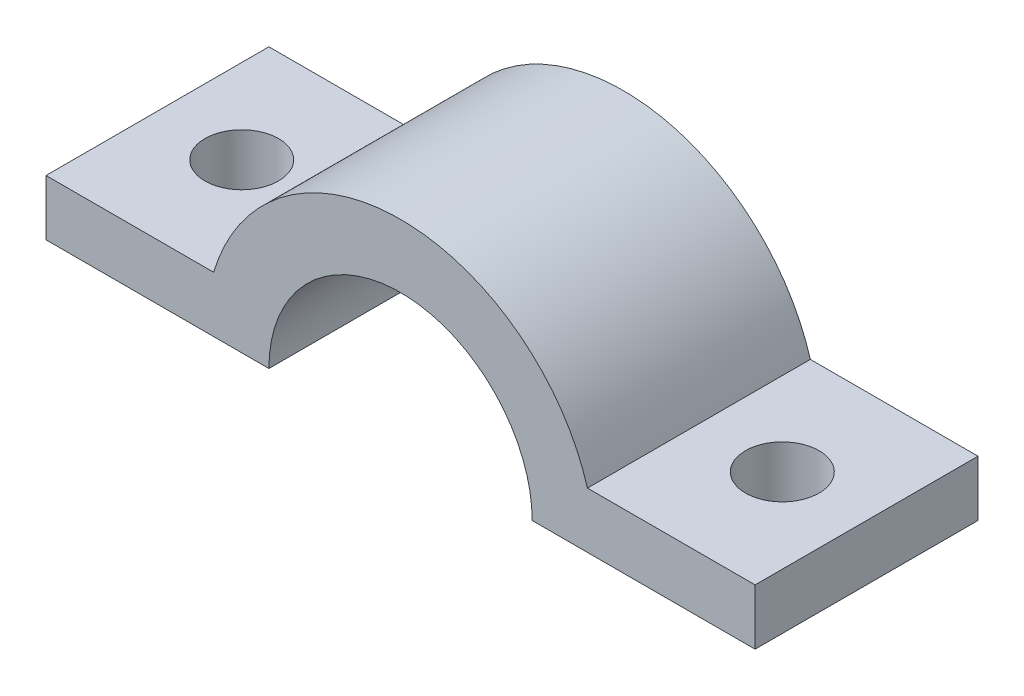
ISO-10303-21;
HEADER;
FILE_DESCRIPTION(('STEP AP214'),'2;1');
FILE_NAME('part.step','',(''),(''),'','','');
FILE_SCHEMA(('AUTOMOTIVE_DESIGN { 1 0 10303 214 1 1 1 1 }'));
ENDSEC;
DATA;
#1=APPLICATION_CONTEXT('core data for automotive mechanical design processes');
#2=APPLICATION_PROTOCOL_DEFINITION('international standard','automotive_design',2000,#1);
#3=PRODUCT_CONTEXT('',#1,'mechanical');
#4=PRODUCT('Part','Part','',(#3));
#5=PRODUCT_RELATED_PRODUCT_CATEGORY('part','',(#4));
#6=PRODUCT_DEFINITION_FORMATION('','',#4);
#7=PRODUCT_DEFINITION_CONTEXT('part definition',#1,'design');
#8=PRODUCT_DEFINITION('design','',#6,#7);
#9=PRODUCT_DEFINITION_SHAPE('','',#8);
#10=(LENGTH_UNIT() NAMED_UNIT(*) SI_UNIT(.MILLI.,.METRE.));
#11=(NAMED_UNIT(*) PLANE_ANGLE_UNIT() SI_UNIT($,.RADIAN.));
#12=(NAMED_UNIT(*) SI_UNIT($,.STERADIAN.) SOLID_ANGLE_UNIT());
#13=UNCERTAINTY_MEASURE_WITH_UNIT(LENGTH_MEASURE(1.E-05),#10,'distance_accuracy_value','');
#14=(GEOMETRIC_REPRESENTATION_CONTEXT(3) GLOBAL_UNCERTAINTY_ASSIGNED_CONTEXT((#13)) GLOBAL_UNIT_ASSIGNED_CONTEXT((#10,
#11,#12)) REPRESENTATION_CONTEXT('',''));
#15=CARTESIAN_POINT('',(0.,0.,0.));
#16=DIRECTION('',(0.,0.,1.));
#17=DIRECTION('',(1.,0.,0.));
#18=AXIS2_PLACEMENT_3D('',#15,#16,#17);
#19=CARTESIAN_POINT('',(-40.4,0.,25.4));
#20=DIRECTION('',(1.,0.,0.));
#21=DIRECTION('',(0.,0.,-1.));
#22=AXIS2_PLACEMENT_3D('',#19,#20,#21);
#23=PLANE('',#22);
#24=DIRECTION('',(0.,-1.,0.));
#25=VECTOR('',#24,1.);
#26=CARTESIAN_POINT('',(-40.4,0.,0.));
#27=LINE('',#26,#25);
#28=CARTESIAN_POINT('',(-40.4,6.35,0.));
#29=VERTEX_POINT('',#28);
#30=CARTESIAN_POINT('',(-40.4,0.,0.));
#31=VERTEX_POINT('',#30);
#32=EDGE_CURVE('E144',#29,#31,#27,.T.);
#33=ORIENTED_EDGE('',*,*,#32,.T.);
#34=DIRECTION('',(0.,0.,-1.));
#35=VECTOR('',#34,1.);
#36=CARTESIAN_POINT('',(-40.4,0.,25.4));
#37=LINE('',#36,#35);
#38=CARTESIAN_POINT('',(-40.4,0.,25.4));
#39=VERTEX_POINT('',#38);
#40=EDGE_CURVE('E11',#39,#31,#37,.T.);
#41=ORIENTED_EDGE('',*,*,#40,.F.);
#42=DIRECTION('',(0.,-1.,0.));
#43=VECTOR('',#42,1.);
#44=CARTESIAN_POINT('',(-40.4,0.,25.4));
#45=LINE('',#44,#43);
#46=CARTESIAN_POINT('',(-40.4,6.35,25.4));
#47=VERTEX_POINT('',#46);
#48=EDGE_CURVE('E167',#47,#39,#45,.T.);
#49=ORIENTED_EDGE('',*,*,#48,.F.);
#50=DIRECTION('',(0.,0.,-1.));
#51=VECTOR('',#50,1.);
#52=CARTESIAN_POINT('',(-40.4,6.35,25.4));
#53=LINE('',#52,#51);
#54=EDGE_CURVE('E140',#47,#29,#53,.T.);
#55=ORIENTED_EDGE('',*,*,#54,.T.);
#56=EDGE_LOOP('',(#33,#41,#49,#55));
#57=FACE_BOUND('',#56,.T.);
#58=ADVANCED_FACE('F43',(#57),#23,.F.);
#59=CARTESIAN_POINT('',(-40.4,0.,25.4));
#60=DIRECTION('',(0.,1.,0.));
#61=DIRECTION('',(0.,0.,1.));
#62=AXIS2_PLACEMENT_3D('',#59,#60,#61);
#63=PLANE('',#62);
#64=CARTESIAN_POINT('',(-30.7985474856855,0.,12.7));
#65=DIRECTION('',(0.,1.,0.));
#66=DIRECTION('',(0.,0.,1.));
#67=AXIS2_PLACEMENT_3D('',#64,#65,#66);
#68=CIRCLE('',#67,4.191);
#69=CARTESIAN_POINT('',(-30.7985474856855,0.,16.891));
#70=VERTEX_POINT('',#69);
#71=EDGE_CURVE('E149',#70,#70,#68,.F.);
#72=ORIENTED_EDGE('',*,*,#71,.F.);
#73=EDGE_LOOP('',(#72));
#74=FACE_BOUND('',#73,.T.);
#75=DIRECTION('',(1.,0.,0.));
#76=VECTOR('',#75,1.);
#77=CARTESIAN_POINT('',(-40.4,0.,0.));
#78=LINE('',#77,#76);
#79=CARTESIAN_POINT('',(-15.,0.,0.));
#80=VERTEX_POINT('',#79);
#81=EDGE_CURVE('E148',#31,#80,#78,.T.);
#82=ORIENTED_EDGE('',*,*,#81,.T.);
#83=DIRECTION('',(0.,0.,-1.));
#84=VECTOR('',#83,1.);
#85=CARTESIAN_POINT('',(-15.,0.,25.4));
#86=LINE('',#85,#84);
#87=CARTESIAN_POINT('',(-15.,0.,25.4));
#88=VERTEX_POINT('',#87);
#89=EDGE_CURVE('E52',#88,#80,#86,.T.);
#90=ORIENTED_EDGE('',*,*,#89,.F.);
#91=DIRECTION('',(1.,0.,0.));
#92=VECTOR('',#91,1.);
#93=CARTESIAN_POINT('',(-40.4,0.,25.4));
#94=LINE('',#93,#92);
#95=EDGE_CURVE('E103',#39,#88,#94,.T.);
#96=ORIENTED_EDGE('',*,*,#95,.F.);
#97=ORIENTED_EDGE('',*,*,#40,.T.);
#98=EDGE_LOOP('',(#82,#90,#96,#97));
#99=FACE_BOUND('',#98,.T.);
#100=ADVANCED_FACE('F242',(#74,#99),#63,.F.);
#101=CARTESIAN_POINT('',(0.,0.,25.4));
#102=DIRECTION('',(0.,0.,-1.));
#103=DIRECTION('',(-1.,0.,0.));
#104=AXIS2_PLACEMENT_3D('',#101,#102,#103);
#105=CYLINDRICAL_SURFACE('',#104,15.);
#106=CARTESIAN_POINT('',(0.,0.,0.));
#107=DIRECTION('',(0.,0.,-1.));
#108=DIRECTION('',(1.,0.,0.));
#109=AXIS2_PLACEMENT_3D('',#106,#107,#108);
#110=CIRCLE('',#109,15.);
#111=CARTESIAN_POINT('',(15.,0.,0.));
#112=VERTEX_POINT('',#111);
#113=EDGE_CURVE('E152',#80,#112,#110,.T.);
#114=ORIENTED_EDGE('',*,*,#113,.T.);
#115=DIRECTION('',(0.,0.,-1.));
#116=VECTOR('',#115,1.);
#117=CARTESIAN_POINT('',(15.,0.,25.4));
#118=LINE('',#117,#116);
#119=CARTESIAN_POINT('',(15.,0.,25.4));
#120=VERTEX_POINT('',#119);
#121=EDGE_CURVE('E178',#120,#112,#118,.T.);
#122=ORIENTED_EDGE('',*,*,#121,.F.);
#123=CARTESIAN_POINT('',(0.,0.,25.4));
#124=DIRECTION('',(0.,0.,-1.));
#125=DIRECTION('',(1.,0.,0.));
#126=AXIS2_PLACEMENT_3D('',#123,#124,#125);
#127=CIRCLE('',#126,15.);
#128=EDGE_CURVE('E188',#88,#120,#127,.T.);
#129=ORIENTED_EDGE('',*,*,#128,.F.);
#130=ORIENTED_EDGE('',*,*,#89,.T.);
#131=EDGE_LOOP('',(#114,#122,#129,#130));
#132=FACE_BOUND('',#131,.T.);
#133=ADVANCED_FACE('F186',(#132),#105,.F.);
#134=CARTESIAN_POINT('',(15.,0.,25.4));
#135=DIRECTION('',(0.,1.,0.));
#136=DIRECTION('',(0.,0.,1.));
#137=AXIS2_PLACEMENT_3D('',#134,#135,#136);
#138=PLANE('',#137);
#139=CARTESIAN_POINT('',(30.7985538856855,0.,12.7));
#140=DIRECTION('',(0.,1.,0.));
#141=DIRECTION('',(0.,0.,1.));
#142=AXIS2_PLACEMENT_3D('',#139,#140,#141);
#143=CIRCLE('',#142,4.191);
#144=CARTESIAN_POINT('',(30.7985538856855,0.,16.891));
#145=VERTEX_POINT('',#144);
#146=EDGE_CURVE('E216',#145,#145,#143,.F.);
#147=ORIENTED_EDGE('',*,*,#146,.F.);
#148=EDGE_LOOP('',(#147));
#149=FACE_BOUND('',#148,.T.);
#150=DIRECTION('',(1.,0.,0.));
#151=VECTOR('',#150,1.);
#152=CARTESIAN_POINT('',(15.,0.,0.));
#153=LINE('',#152,#151);
#154=CARTESIAN_POINT('',(40.4,0.,0.));
#155=VERTEX_POINT('',#154);
#156=EDGE_CURVE('E155',#112,#155,#153,.T.);
#157=ORIENTED_EDGE('',*,*,#156,.T.);
#158=DIRECTION('',(0.,0.,-1.));
#159=VECTOR('',#158,1.);
#160=CARTESIAN_POINT('',(40.4,0.,25.4));
#161=LINE('',#160,#159);
#162=CARTESIAN_POINT('',(40.4,0.,25.4));
#163=VERTEX_POINT('',#162);
#164=EDGE_CURVE('E174',#163,#155,#161,.T.);
#165=ORIENTED_EDGE('',*,*,#164,.F.);
#166=DIRECTION('',(1.,0.,0.));
#167=VECTOR('',#166,1.);
#168=CARTESIAN_POINT('',(15.,0.,25.4));
#169=LINE('',#168,#167);
#170=EDGE_CURVE('E201',#120,#163,#169,.T.);
#171=ORIENTED_EDGE('',*,*,#170,.F.);
#172=ORIENTED_EDGE('',*,*,#121,.T.);
#173=EDGE_LOOP('',(#157,#165,#171,#172));
#174=FACE_BOUND('',#173,.T.);
#175=ADVANCED_FACE('F196',(#149,#174),#138,.F.);
#176=CARTESIAN_POINT('',(40.4,0.,25.4));
#177=DIRECTION('',(-1.,0.,0.));
#178=DIRECTION('',(0.,0.,1.));
#179=AXIS2_PLACEMENT_3D('',#176,#177,#178);
#180=PLANE('',#179);
#181=DIRECTION('',(0.,1.,0.));
#182=VECTOR('',#181,1.);
#183=CARTESIAN_POINT('',(40.4,0.,0.));
#184=LINE('',#183,#182);
#185=CARTESIAN_POINT('',(40.4,6.35,0.));
#186=VERTEX_POINT('',#185);
#187=EDGE_CURVE('E158',#155,#186,#184,.T.);
#188=ORIENTED_EDGE('',*,*,#187,.T.);
#189=DIRECTION('',(0.,0.,-1.));
#190=VECTOR('',#189,1.);
#191=CARTESIAN_POINT('',(40.4,6.35,25.4));
#192=LINE('',#191,#190);
#193=CARTESIAN_POINT('',(40.4,6.35,25.4));
#194=VERTEX_POINT('',#193);
#195=EDGE_CURVE('E133',#194,#186,#192,.T.);
#196=ORIENTED_EDGE('',*,*,#195,.F.);
#197=DIRECTION('',(0.,1.,0.));
#198=VECTOR('',#197,1.);
#199=CARTESIAN_POINT('',(40.4,0.,25.4));
#200=LINE('',#199,#198);
#201=EDGE_CURVE('E122',#163,#194,#200,.T.);
#202=ORIENTED_EDGE('',*,*,#201,.F.);
#203=ORIENTED_EDGE('',*,*,#164,.T.);
#204=EDGE_LOOP('',(#188,#196,#202,#203));
#205=FACE_BOUND('',#204,.T.);
#206=ADVANCED_FACE('F199',(#205),#180,.F.);
#207=CARTESIAN_POINT('',(21.2985474856855,6.35,25.4));
#208=DIRECTION('',(0.,-1.,0.));
#209=DIRECTION('',(1.,0.,0.));
#210=AXIS2_PLACEMENT_3D('',#207,#208,#209);
#211=PLANE('',#210);
#212=CARTESIAN_POINT('',(30.7985538856855,6.35000000000001,12.7));
#213=DIRECTION('',(0.,1.,0.));
#214=DIRECTION('',(-1.,0.,0.));
#215=AXIS2_PLACEMENT_3D('',#212,#213,#214);
#216=CIRCLE('',#215,4.191);
#217=CARTESIAN_POINT('',(26.6075538856855,6.35000000000001,12.7));
#218=VERTEX_POINT('',#217);
#219=EDGE_CURVE('E211',#218,#218,#216,.T.);
#220=ORIENTED_EDGE('',*,*,#219,.F.);
#221=EDGE_LOOP('',(#220));
#222=FACE_BOUND('',#221,.T.);
#223=DIRECTION('',(-1.,0.,0.));
#224=VECTOR('',#223,1.);
#225=CARTESIAN_POINT('',(21.2985474856855,6.35,0.));
#226=LINE('',#225,#224);
#227=CARTESIAN_POINT('',(21.2985474856855,6.35,0.));
#228=VERTEX_POINT('',#227);
#229=EDGE_CURVE('E131',#186,#228,#226,.T.);
#230=ORIENTED_EDGE('',*,*,#229,.T.);
#231=DIRECTION('',(0.,0.,-1.));
#232=VECTOR('',#231,1.);
#233=CARTESIAN_POINT('',(21.2985474856855,6.35,25.4));
#234=LINE('',#233,#232);
#235=CARTESIAN_POINT('',(21.2985474856855,6.35,25.4));
#236=VERTEX_POINT('',#235);
#237=EDGE_CURVE('E128',#236,#228,#234,.T.);
#238=ORIENTED_EDGE('',*,*,#237,.F.);
#239=DIRECTION('',(-1.,0.,0.));
#240=VECTOR('',#239,1.);
#241=CARTESIAN_POINT('',(21.2985474856855,6.35,25.4));
#242=LINE('',#241,#240);
#243=EDGE_CURVE('E116',#194,#236,#242,.T.);
#244=ORIENTED_EDGE('',*,*,#243,.F.);
#245=ORIENTED_EDGE('',*,*,#195,.T.);
#246=EDGE_LOOP('',(#230,#238,#244,#245));
#247=FACE_BOUND('',#246,.T.);
#248=ADVANCED_FACE('F129',(#222,#247),#211,.F.);
#249=CARTESIAN_POINT('',(0.,0.,25.4));
#250=DIRECTION('',(0.,0.,-1.));
#251=DIRECTION('',(-1.,0.,0.));
#252=AXIS2_PLACEMENT_3D('',#249,#250,#251);
#253=CYLINDRICAL_SURFACE('',#252,22.225);
#254=CARTESIAN_POINT('',(0.,0.,0.));
#255=DIRECTION('',(0.,0.,1.));
#256=DIRECTION('',(1.,0.,0.));
#257=AXIS2_PLACEMENT_3D('',#254,#255,#256);
#258=CIRCLE('',#257,22.225);
#259=CARTESIAN_POINT('',(-21.2985474856855,6.35,0.));
#260=VERTEX_POINT('',#259);
#261=EDGE_CURVE('E89',#228,#260,#258,.T.);
#262=ORIENTED_EDGE('',*,*,#261,.T.);
#263=DIRECTION('',(0.,0.,-1.));
#264=VECTOR('',#263,1.);
#265=CARTESIAN_POINT('',(-21.2985474856855,6.35,25.4));
#266=LINE('',#265,#264);
#267=CARTESIAN_POINT('',(-21.2985474856855,6.35,25.4));
#268=VERTEX_POINT('',#267);
#269=EDGE_CURVE('E134',#268,#260,#266,.T.);
#270=ORIENTED_EDGE('',*,*,#269,.F.);
#271=CARTESIAN_POINT('',(0.,0.,25.4));
#272=DIRECTION('',(0.,0.,1.));
#273=DIRECTION('',(1.,0.,0.));
#274=AXIS2_PLACEMENT_3D('',#271,#272,#273);
#275=CIRCLE('',#274,22.225);
#276=EDGE_CURVE('E120',#236,#268,#275,.T.);
#277=ORIENTED_EDGE('',*,*,#276,.F.);
#278=ORIENTED_EDGE('',*,*,#237,.T.);
#279=EDGE_LOOP('',(#262,#270,#277,#278));
#280=FACE_BOUND('',#279,.T.);
#281=ADVANCED_FACE('F136',(#280),#253,.T.);
#282=CARTESIAN_POINT('',(-21.2985474856855,6.35,25.4));
#283=DIRECTION('',(0.,-1.,0.));
#284=DIRECTION('',(1.,0.,0.));
#285=AXIS2_PLACEMENT_3D('',#282,#283,#284);
#286=PLANE('',#285);
#287=CARTESIAN_POINT('',(-30.7985474856855,6.35,12.7));
#288=DIRECTION('',(0.,1.,0.));
#289=DIRECTION('',(-1.,0.,0.));
#290=AXIS2_PLACEMENT_3D('',#287,#288,#289);
#291=CIRCLE('',#290,4.191);
#292=CARTESIAN_POINT('',(-34.9895474856855,6.35,12.7));
#293=VERTEX_POINT('',#292);
#294=EDGE_CURVE('E215',#293,#293,#291,.T.);
#295=ORIENTED_EDGE('',*,*,#294,.F.);
#296=EDGE_LOOP('',(#295));
#297=FACE_BOUND('',#296,.T.);
#298=DIRECTION('',(-1.,0.,0.));
#299=VECTOR('',#298,1.);
#300=CARTESIAN_POINT('',(-21.2985474856855,6.35,0.));
#301=LINE('',#300,#299);
#302=EDGE_CURVE('E95',#260,#29,#301,.T.);
#303=ORIENTED_EDGE('',*,*,#302,.T.);
#304=ORIENTED_EDGE('',*,*,#54,.F.);
#305=DIRECTION('',(-1.,0.,0.));
#306=VECTOR('',#305,1.);
#307=CARTESIAN_POINT('',(-21.2985474856855,6.35,25.4));
#308=LINE('',#307,#306);
#309=EDGE_CURVE('E60',#268,#47,#308,.T.);
#310=ORIENTED_EDGE('',*,*,#309,.F.);
#311=ORIENTED_EDGE('',*,*,#269,.T.);
#312=EDGE_LOOP('',(#303,#304,#310,#311));
#313=FACE_BOUND('',#312,.T.);
#314=ADVANCED_FACE('F229',(#297,#313),#286,.F.);
#315=CARTESIAN_POINT('',(0.,0.,25.4));
#316=DIRECTION('',(0.,0.,1.));
#317=DIRECTION('',(1.,0.,0.));
#318=AXIS2_PLACEMENT_3D('',#315,#316,#317);
#319=PLANE('',#318);
#320=ORIENTED_EDGE('',*,*,#48,.T.);
#321=ORIENTED_EDGE('',*,*,#95,.T.);
#322=ORIENTED_EDGE('',*,*,#128,.T.);
#323=ORIENTED_EDGE('',*,*,#170,.T.);
#324=ORIENTED_EDGE('',*,*,#201,.T.);
#325=ORIENTED_EDGE('',*,*,#243,.T.);
#326=ORIENTED_EDGE('',*,*,#276,.T.);
#327=ORIENTED_EDGE('',*,*,#309,.T.);
#328=EDGE_LOOP('',(#320,#321,#322,#323,#324,#325,#326,#327));
#329=FACE_BOUND('',#328,.T.);
#330=ADVANCED_FACE('F118',(#329),#319,.T.);
#331=CARTESIAN_POINT('',(0.,0.,0.));
#332=DIRECTION('',(0.,0.,1.));
#333=DIRECTION('',(1.,0.,0.));
#334=AXIS2_PLACEMENT_3D('',#331,#332,#333);
#335=PLANE('',#334);
#336=ORIENTED_EDGE('',*,*,#32,.F.);
#337=ORIENTED_EDGE('',*,*,#302,.F.);
#338=ORIENTED_EDGE('',*,*,#261,.F.);
#339=ORIENTED_EDGE('',*,*,#229,.F.);
#340=ORIENTED_EDGE('',*,*,#187,.F.);
#341=ORIENTED_EDGE('',*,*,#156,.F.);
#342=ORIENTED_EDGE('',*,*,#113,.F.);
#343=ORIENTED_EDGE('',*,*,#81,.F.);
#344=EDGE_LOOP('',(#336,#337,#338,#339,#340,#341,#342,#343));
#345=FACE_BOUND('',#344,.T.);
#346=ADVANCED_FACE('F192',(#345),#335,.F.);
#347=CARTESIAN_POINT('',(-30.7985474856855,-11.8539380798113,12.7));
#348=DIRECTION('',(0.,1.,0.));
#349=DIRECTION('',(-1.,0.,0.));
#350=AXIS2_PLACEMENT_3D('',#347,#348,#349);
#351=CYLINDRICAL_SURFACE('',#350,4.191);
#352=ORIENTED_EDGE('',*,*,#71,.T.);
#353=EDGE_LOOP('',(#352));
#354=FACE_BOUND('',#353,.T.);
#355=ORIENTED_EDGE('',*,*,#294,.T.);
#356=EDGE_LOOP('',(#355));
#357=FACE_BOUND('',#356,.T.);
#358=ADVANCED_FACE('F227',(#354,#357),#351,.F.);
#359=CARTESIAN_POINT('',(30.7985538856855,-11.8539380798113,12.7));
#360=DIRECTION('',(0.,1.,0.));
#361=DIRECTION('',(-1.,0.,0.));
#362=AXIS2_PLACEMENT_3D('',#359,#360,#361);
#363=CYLINDRICAL_SURFACE('',#362,4.191);
#364=ORIENTED_EDGE('',*,*,#146,.T.);
#365=EDGE_LOOP('',(#364));
#366=FACE_BOUND('',#365,.T.);
#367=ORIENTED_EDGE('',*,*,#219,.T.);
#368=EDGE_LOOP('',(#367));
#369=FACE_BOUND('',#368,.T.);
#370=ADVANCED_FACE('F267',(#366,#369),#363,.F.);
#371=CLOSED_SHELL('',(#58,#100,#133,#175,#206,#248,#281,#314,#330,#346,#358,#370));
#372=MANIFOLD_SOLID_BREP('B2',#371);
#373=ADVANCED_BREP_SHAPE_REPRESENTATION('',(#18,#372),#14);
#374=SHAPE_DEFINITION_REPRESENTATION(#9,#373);
ENDSEC;
END-ISO-10303-21;
